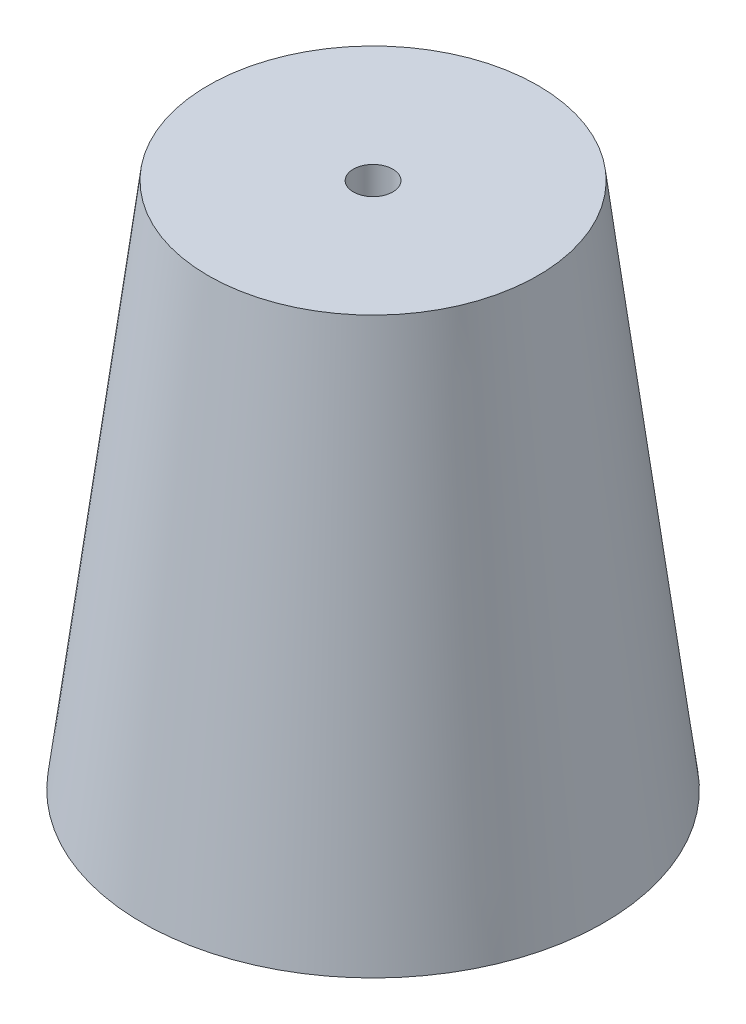
ISO-10303-21;
HEADER;
FILE_DESCRIPTION(('STEP AP214'),'2;1');
FILE_NAME('part.step','',(''),(''),'','','');
FILE_SCHEMA(('AUTOMOTIVE_DESIGN { 1 0 10303 214 1 1 1 1 }'));
ENDSEC;
DATA;
#1=APPLICATION_CONTEXT('core data for automotive mechanical design processes');
#2=APPLICATION_PROTOCOL_DEFINITION('international standard','automotive_design',2000,#1);
#3=PRODUCT_CONTEXT('',#1,'mechanical');
#4=PRODUCT('Part','Part','',(#3));
#5=PRODUCT_RELATED_PRODUCT_CATEGORY('part','',(#4));
#6=PRODUCT_DEFINITION_FORMATION('','',#4);
#7=PRODUCT_DEFINITION_CONTEXT('part definition',#1,'design');
#8=PRODUCT_DEFINITION('design','',#6,#7);
#9=PRODUCT_DEFINITION_SHAPE('','',#8);
#10=(LENGTH_UNIT() NAMED_UNIT(*) SI_UNIT(.MILLI.,.METRE.));
#11=(NAMED_UNIT(*) PLANE_ANGLE_UNIT() SI_UNIT($,.RADIAN.));
#12=(NAMED_UNIT(*) SI_UNIT($,.STERADIAN.) SOLID_ANGLE_UNIT());
#13=UNCERTAINTY_MEASURE_WITH_UNIT(LENGTH_MEASURE(1.E-05),#10,'distance_accuracy_value','');
#14=(GEOMETRIC_REPRESENTATION_CONTEXT(3) GLOBAL_UNCERTAINTY_ASSIGNED_CONTEXT((#13)) GLOBAL_UNIT_ASSIGNED_CONTEXT((#10,
#11,#12)) REPRESENTATION_CONTEXT('',''));
#15=CARTESIAN_POINT('',(0.,0.,0.));
#16=DIRECTION('',(0.,0.,1.));
#17=DIRECTION('',(1.,0.,0.));
#18=AXIS2_PLACEMENT_3D('',#15,#16,#17);
#19=CARTESIAN_POINT('',(0.,0.,0.));
#20=DIRECTION('',(0.,1.,0.));
#21=DIRECTION('',(0.,0.,1.));
#22=AXIS2_PLACEMENT_3D('',#19,#20,#21);
#23=PLANE('',#22);
#24=CARTESIAN_POINT('',(0.,0.,0.));
#25=DIRECTION('',(0.,-1.,0.));
#26=DIRECTION('',(0.,0.,-1.));
#27=AXIS2_PLACEMENT_3D('',#24,#25,#26);
#28=CIRCLE('',#27,2.99751538925253);
#29=CARTESIAN_POINT('',(0.,0.,-2.99751538925253));
#30=VERTEX_POINT('',#29);
#31=EDGE_CURVE('E49',#30,#30,#28,.T.);
#32=ORIENTED_EDGE('',*,*,#31,.T.);
#33=EDGE_LOOP('',(#32));
#34=FACE_BOUND('',#33,.T.);
#35=CARTESIAN_POINT('',(0.,0.,0.));
#36=DIRECTION('',(0.,-1.,0.));
#37=DIRECTION('',(0.,0.,-1.));
#38=AXIS2_PLACEMENT_3D('',#35,#36,#37);
#39=CIRCLE('',#38,25.);
#40=CARTESIAN_POINT('',(0.,0.,-25.));
#41=VERTEX_POINT('',#40);
#42=EDGE_CURVE('E10',#41,#41,#39,.T.);
#43=ORIENTED_EDGE('',*,*,#42,.F.);
#44=EDGE_LOOP('',(#43));
#45=FACE_BOUND('',#44,.T.);
#46=ADVANCED_FACE('F30',(#34,#45),#23,.T.);
#47=CARTESIAN_POINT('',(0.,-80.,0.));
#48=DIRECTION('',(0.,-1.,0.));
#49=DIRECTION('',(0.,0.,-1.));
#50=AXIS2_PLACEMENT_3D('',#47,#48,#49);
#51=CONICAL_SURFACE('',#50,35.,0.124354994546762);
#52=ORIENTED_EDGE('',*,*,#42,.T.);
#53=EDGE_LOOP('',(#52));
#54=FACE_BOUND('',#53,.T.);
#55=CARTESIAN_POINT('',(0.,-80.,0.));
#56=DIRECTION('',(0.,-1.,0.));
#57=DIRECTION('',(0.,0.,-1.));
#58=AXIS2_PLACEMENT_3D('',#55,#56,#57);
#59=CIRCLE('',#58,35.);
#60=CARTESIAN_POINT('',(0.,-80.,-35.));
#61=VERTEX_POINT('',#60);
#62=EDGE_CURVE('E36',#61,#61,#59,.T.);
#63=ORIENTED_EDGE('',*,*,#62,.F.);
#64=EDGE_LOOP('',(#63));
#65=FACE_BOUND('',#64,.T.);
#66=ADVANCED_FACE('F76',(#54,#65),#51,.T.);
#67=CARTESIAN_POINT('',(0.,-80.,-35.));
#68=DIRECTION('',(0.,-1.,0.));
#69=DIRECTION('',(0.,0.,-1.));
#70=AXIS2_PLACEMENT_3D('',#67,#68,#69);
#71=PLANE('',#70);
#72=ORIENTED_EDGE('',*,*,#62,.T.);
#73=EDGE_LOOP('',(#72));
#74=FACE_BOUND('',#73,.T.);
#75=CARTESIAN_POINT('',(0.,-80.,0.));
#76=DIRECTION('',(0.,-1.,0.));
#77=DIRECTION('',(0.,0.,-1.));
#78=AXIS2_PLACEMENT_3D('',#75,#76,#77);
#79=CIRCLE('',#78,20.);
#80=CARTESIAN_POINT('',(0.,-80.,-20.));
#81=VERTEX_POINT('',#80);
#82=EDGE_CURVE('E40',#81,#81,#79,.T.);
#83=ORIENTED_EDGE('',*,*,#82,.F.);
#84=EDGE_LOOP('',(#83));
#85=FACE_BOUND('',#84,.T.);
#86=ADVANCED_FACE('F70',(#74,#85),#71,.T.);
#87=CARTESIAN_POINT('',(0.,-10.,0.));
#88=DIRECTION('',(0.,-1.,0.));
#89=DIRECTION('',(0.,0.,-1.));
#90=AXIS2_PLACEMENT_3D('',#87,#88,#89);
#91=CONICAL_SURFACE('',#90,11.25,0.124354994546762);
#92=ORIENTED_EDGE('',*,*,#82,.T.);
#93=EDGE_LOOP('',(#92));
#94=FACE_BOUND('',#93,.T.);
#95=CARTESIAN_POINT('',(0.,-10.,0.));
#96=DIRECTION('',(0.,-1.,0.));
#97=DIRECTION('',(0.,0.,-1.));
#98=AXIS2_PLACEMENT_3D('',#95,#96,#97);
#99=CIRCLE('',#98,11.25);
#100=CARTESIAN_POINT('',(0.,-10.,-11.25));
#101=VERTEX_POINT('',#100);
#102=EDGE_CURVE('E44',#101,#101,#99,.T.);
#103=ORIENTED_EDGE('',*,*,#102,.F.);
#104=EDGE_LOOP('',(#103));
#105=FACE_BOUND('',#104,.T.);
#106=ADVANCED_FACE('F65',(#94,#105),#91,.F.);
#107=CARTESIAN_POINT('',(0.,-10.,-11.25));
#108=DIRECTION('',(0.,-1.,0.));
#109=DIRECTION('',(0.,0.,-1.));
#110=AXIS2_PLACEMENT_3D('',#107,#108,#109);
#111=PLANE('',#110);
#112=CARTESIAN_POINT('',(0.,-10.,0.));
#113=DIRECTION('',(0.,-1.,0.));
#114=DIRECTION('',(0.,0.,-1.));
#115=AXIS2_PLACEMENT_3D('',#112,#113,#114);
#116=CIRCLE('',#115,6.);
#117=CARTESIAN_POINT('',(0.,-10.,-6.));
#118=VERTEX_POINT('',#117);
#119=EDGE_CURVE('E55',#118,#118,#116,.T.);
#120=ORIENTED_EDGE('',*,*,#119,.F.);
#121=EDGE_LOOP('',(#120));
#122=FACE_BOUND('',#121,.T.);
#123=ORIENTED_EDGE('',*,*,#102,.T.);
#124=EDGE_LOOP('',(#123));
#125=FACE_BOUND('',#124,.T.);
#126=ADVANCED_FACE('F61',(#122,#125),#111,.T.);
#127=CARTESIAN_POINT('',(0.,-10.,0.));
#128=DIRECTION('',(0.,-1.,0.));
#129=DIRECTION('',(0.,0.,-1.));
#130=AXIS2_PLACEMENT_3D('',#127,#128,#129);
#131=CYLINDRICAL_SURFACE('',#130,2.99751538925254);
#132=ORIENTED_EDGE('',*,*,#31,.F.);
#133=EDGE_LOOP('',(#132));
#134=FACE_BOUND('',#133,.T.);
#135=CARTESIAN_POINT('',(0.,-5.,0.));
#136=DIRECTION('',(0.,-1.,0.));
#137=DIRECTION('',(0.,0.,-1.));
#138=AXIS2_PLACEMENT_3D('',#135,#136,#137);
#139=CIRCLE('',#138,2.99751538925254);
#140=CARTESIAN_POINT('',(0.,-5.,-2.99751538925254));
#141=VERTEX_POINT('',#140);
#142=EDGE_CURVE('E52',#141,#141,#139,.T.);
#143=ORIENTED_EDGE('',*,*,#142,.T.);
#144=EDGE_LOOP('',(#143));
#145=FACE_BOUND('',#144,.T.);
#146=ADVANCED_FACE('F64',(#134,#145),#131,.F.);
#147=CARTESIAN_POINT('',(0.,-10.,0.));
#148=DIRECTION('',(0.,-1.,0.));
#149=DIRECTION('',(0.,0.,-1.));
#150=AXIS2_PLACEMENT_3D('',#147,#148,#149);
#151=CONICAL_SURFACE('',#150,6.,0.540784804102092);
#152=ORIENTED_EDGE('',*,*,#142,.F.);
#153=EDGE_LOOP('',(#152));
#154=FACE_BOUND('',#153,.T.);
#155=ORIENTED_EDGE('',*,*,#119,.T.);
#156=EDGE_LOOP('',(#155));
#157=FACE_BOUND('',#156,.T.);
#158=ADVANCED_FACE('F59',(#154,#157),#151,.F.);
#159=CLOSED_SHELL('',(#46,#66,#86,#106,#126,#146,#158));
#160=MANIFOLD_SOLID_BREP('B2',#159);
#161=ADVANCED_BREP_SHAPE_REPRESENTATION('',(#18,#160),#14);
#162=SHAPE_DEFINITION_REPRESENTATION(#9,#161);
ENDSEC;
END-ISO-10303-21;
